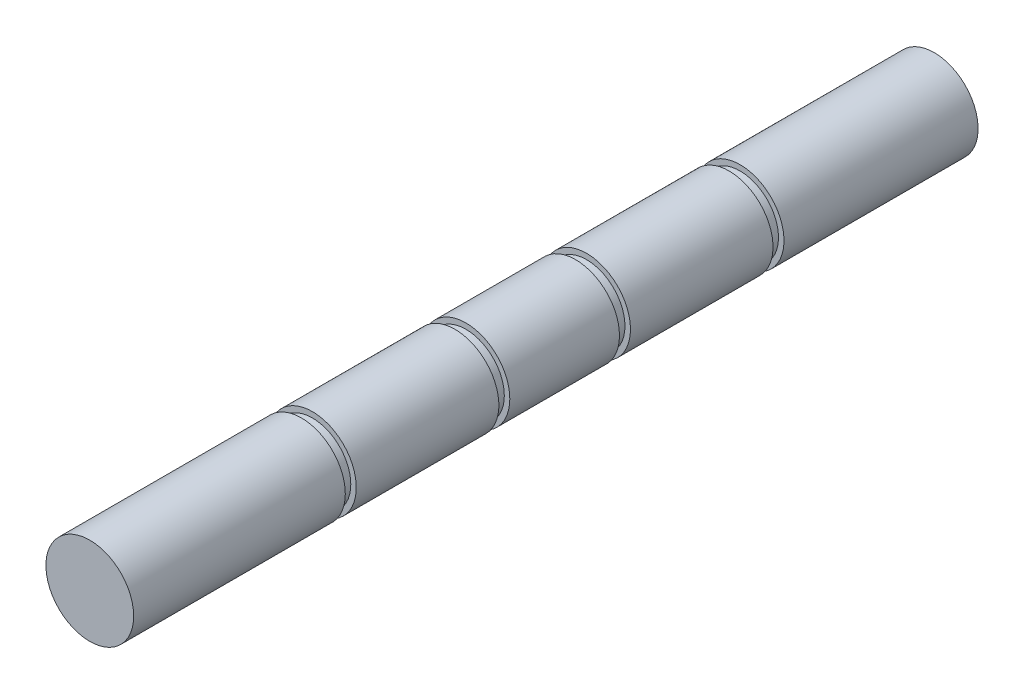
ISO-10303-21;
HEADER;
FILE_DESCRIPTION(('STEP AP214'),'2;1');
FILE_NAME('part.step','',(''),(''),'','','');
FILE_SCHEMA(('AUTOMOTIVE_DESIGN { 1 0 10303 214 1 1 1 1 }'));
ENDSEC;
DATA;
#1=APPLICATION_CONTEXT('core data for automotive mechanical design processes');
#2=APPLICATION_PROTOCOL_DEFINITION('international standard','automotive_design',2000,#1);
#3=PRODUCT_CONTEXT('',#1,'mechanical');
#4=PRODUCT('Part','Part','',(#3));
#5=PRODUCT_RELATED_PRODUCT_CATEGORY('part','',(#4));
#6=PRODUCT_DEFINITION_FORMATION('','',#4);
#7=PRODUCT_DEFINITION_CONTEXT('part definition',#1,'design');
#8=PRODUCT_DEFINITION('design','',#6,#7);
#9=PRODUCT_DEFINITION_SHAPE('','',#8);
#10=(LENGTH_UNIT() NAMED_UNIT(*) SI_UNIT(.MILLI.,.METRE.));
#11=(NAMED_UNIT(*) PLANE_ANGLE_UNIT() SI_UNIT($,.RADIAN.));
#12=(NAMED_UNIT(*) SI_UNIT($,.STERADIAN.) SOLID_ANGLE_UNIT());
#13=UNCERTAINTY_MEASURE_WITH_UNIT(LENGTH_MEASURE(1.E-05),#10,'distance_accuracy_value','');
#14=(GEOMETRIC_REPRESENTATION_CONTEXT(3) GLOBAL_UNCERTAINTY_ASSIGNED_CONTEXT((#13)) GLOBAL_UNIT_ASSIGNED_CONTEXT((#10,
#11,#12)) REPRESENTATION_CONTEXT('',''));
#15=CARTESIAN_POINT('',(0.,0.,0.));
#16=DIRECTION('',(0.,0.,1.));
#17=DIRECTION('',(1.,0.,0.));
#18=AXIS2_PLACEMENT_3D('',#15,#16,#17);
#19=CARTESIAN_POINT('',(0.,0.,77.));
#20=DIRECTION('',(0.,0.,-1.));
#21=DIRECTION('',(-1.,0.,0.));
#22=AXIS2_PLACEMENT_3D('',#19,#20,#21);
#23=CYLINDRICAL_SURFACE('',#22,3.5);
#24=CARTESIAN_POINT('',(0.,0.,56.7));
#25=DIRECTION('',(0.,0.,1.));
#26=DIRECTION('',(1.,0.,0.));
#27=AXIS2_PLACEMENT_3D('',#24,#25,#26);
#28=CIRCLE('',#27,3.5);
#29=CARTESIAN_POINT('',(3.5,0.,56.7));
#30=VERTEX_POINT('',#29);
#31=EDGE_CURVE('E49',#30,#30,#28,.T.);
#32=ORIENTED_EDGE('',*,*,#31,.T.);
#33=EDGE_LOOP('',(#32));
#34=FACE_BOUND('',#33,.T.);
#35=CARTESIAN_POINT('',(0.,0.,57.7));
#36=DIRECTION('',(0.,0.,1.));
#37=DIRECTION('',(1.,0.,0.));
#38=AXIS2_PLACEMENT_3D('',#35,#36,#37);
#39=CIRCLE('',#38,3.5);
#40=CARTESIAN_POINT('',(3.5,0.,57.7));
#41=VERTEX_POINT('',#40);
#42=EDGE_CURVE('E10',#41,#41,#39,.T.);
#43=ORIENTED_EDGE('',*,*,#42,.F.);
#44=EDGE_LOOP('',(#43));
#45=FACE_BOUND('',#44,.T.);
#46=ADVANCED_FACE('F30',(#34,#45),#23,.T.);
#47=CARTESIAN_POINT('',(0.,0.,42.7));
#48=DIRECTION('',(0.,0.,1.));
#49=DIRECTION('',(1.,0.,0.));
#50=AXIS2_PLACEMENT_3D('',#47,#48,#49);
#51=CIRCLE('',#50,3.5);
#52=CARTESIAN_POINT('',(3.5,0.,42.7));
#53=VERTEX_POINT('',#52);
#54=EDGE_CURVE('E48',#53,#53,#51,.T.);
#55=ORIENTED_EDGE('',*,*,#54,.T.);
#56=EDGE_LOOP('',(#55));
#57=FACE_BOUND('',#56,.T.);
#58=CARTESIAN_POINT('',(0.,0.,43.7));
#59=DIRECTION('',(0.,0.,1.));
#60=DIRECTION('',(1.,0.,0.));
#61=AXIS2_PLACEMENT_3D('',#58,#59,#60);
#62=CIRCLE('',#61,3.5);
#63=CARTESIAN_POINT('',(3.5,0.,43.7));
#64=VERTEX_POINT('',#63);
#65=EDGE_CURVE('E36',#64,#64,#62,.T.);
#66=ORIENTED_EDGE('',*,*,#65,.F.);
#67=EDGE_LOOP('',(#66));
#68=FACE_BOUND('',#67,.T.);
#69=ADVANCED_FACE('F117',(#57,#68),#23,.T.);
#70=CARTESIAN_POINT('',(0.,0.,31.7));
#71=DIRECTION('',(0.,0.,1.));
#72=DIRECTION('',(1.,0.,0.));
#73=AXIS2_PLACEMENT_3D('',#70,#71,#72);
#74=CIRCLE('',#73,3.5);
#75=CARTESIAN_POINT('',(3.5,0.,31.7));
#76=VERTEX_POINT('',#75);
#77=EDGE_CURVE('E75',#76,#76,#74,.T.);
#78=ORIENTED_EDGE('',*,*,#77,.T.);
#79=EDGE_LOOP('',(#78));
#80=FACE_BOUND('',#79,.T.);
#81=CARTESIAN_POINT('',(0.,0.,32.7));
#82=DIRECTION('',(0.,0.,1.));
#83=DIRECTION('',(1.,0.,0.));
#84=AXIS2_PLACEMENT_3D('',#81,#82,#83);
#85=CIRCLE('',#84,3.5);
#86=CARTESIAN_POINT('',(3.5,0.,32.7));
#87=VERTEX_POINT('',#86);
#88=EDGE_CURVE('E40',#87,#87,#85,.T.);
#89=ORIENTED_EDGE('',*,*,#88,.F.);
#90=EDGE_LOOP('',(#89));
#91=FACE_BOUND('',#90,.T.);
#92=ADVANCED_FACE('F93',(#80,#91),#23,.T.);
#93=CARTESIAN_POINT('',(0.,0.,17.7));
#94=DIRECTION('',(0.,0.,-1.));
#95=DIRECTION('',(-1.,0.,0.));
#96=AXIS2_PLACEMENT_3D('',#93,#94,#95);
#97=CIRCLE('',#96,3.5);
#98=CARTESIAN_POINT('',(-3.5,0.,17.7));
#99=VERTEX_POINT('',#98);
#100=EDGE_CURVE('E82',#99,#99,#97,.T.);
#101=ORIENTED_EDGE('',*,*,#100,.F.);
#102=EDGE_LOOP('',(#101));
#103=FACE_BOUND('',#102,.T.);
#104=CARTESIAN_POINT('',(0.,0.,18.7));
#105=DIRECTION('',(0.,0.,1.));
#106=DIRECTION('',(1.,0.,0.));
#107=AXIS2_PLACEMENT_3D('',#104,#105,#106);
#108=CIRCLE('',#107,3.5);
#109=CARTESIAN_POINT('',(3.5,0.,18.7));
#110=VERTEX_POINT('',#109);
#111=EDGE_CURVE('E45',#110,#110,#108,.T.);
#112=ORIENTED_EDGE('',*,*,#111,.F.);
#113=EDGE_LOOP('',(#112));
#114=FACE_BOUND('',#113,.T.);
#115=ADVANCED_FACE('F118',(#103,#114),#23,.T.);
#116=CARTESIAN_POINT('',(0.,0.,17.7));
#117=DIRECTION('',(0.,0.,-1.));
#118=DIRECTION('',(-1.,0.,0.));
#119=AXIS2_PLACEMENT_3D('',#116,#117,#118);
#120=CYLINDRICAL_SURFACE('',#119,4.);
#121=CARTESIAN_POINT('',(0.,0.,17.7));
#122=DIRECTION('',(0.,0.,-1.));
#123=DIRECTION('',(-1.,0.,0.));
#124=AXIS2_PLACEMENT_3D('',#121,#122,#123);
#125=CIRCLE('',#124,4.);
#126=CARTESIAN_POINT('',(-4.,0.,17.7));
#127=VERTEX_POINT('',#126);
#128=EDGE_CURVE('E79',#127,#127,#125,.T.);
#129=ORIENTED_EDGE('',*,*,#128,.T.);
#130=EDGE_LOOP('',(#129));
#131=FACE_BOUND('',#130,.T.);
#132=CARTESIAN_POINT('',(0.,0.,0.));
#133=DIRECTION('',(0.,0.,-1.));
#134=DIRECTION('',(-1.,0.,0.));
#135=AXIS2_PLACEMENT_3D('',#132,#133,#134);
#136=CIRCLE('',#135,4.);
#137=CARTESIAN_POINT('',(-4.,0.,0.));
#138=VERTEX_POINT('',#137);
#139=EDGE_CURVE('E83',#138,#138,#136,.T.);
#140=ORIENTED_EDGE('',*,*,#139,.F.);
#141=EDGE_LOOP('',(#140));
#142=FACE_BOUND('',#141,.T.);
#143=ADVANCED_FACE('F125',(#131,#142),#120,.T.);
#144=CARTESIAN_POINT('',(0.,0.,17.7));
#145=DIRECTION('',(0.,0.,-1.));
#146=DIRECTION('',(-1.,0.,0.));
#147=AXIS2_PLACEMENT_3D('',#144,#145,#146);
#148=PLANE('',#147);
#149=ORIENTED_EDGE('',*,*,#100,.T.);
#150=EDGE_LOOP('',(#149));
#151=FACE_BOUND('',#150,.T.);
#152=ORIENTED_EDGE('',*,*,#128,.F.);
#153=EDGE_LOOP('',(#152));
#154=FACE_BOUND('',#153,.T.);
#155=ADVANCED_FACE('F131',(#151,#154),#148,.F.);
#156=CARTESIAN_POINT('',(0.,0.,0.));
#157=DIRECTION('',(0.,0.,1.));
#158=DIRECTION('',(1.,0.,0.));
#159=AXIS2_PLACEMENT_3D('',#156,#157,#158);
#160=PLANE('',#159);
#161=ORIENTED_EDGE('',*,*,#139,.T.);
#162=EDGE_LOOP('',(#161));
#163=FACE_BOUND('',#162,.T.);
#164=ADVANCED_FACE('F100',(#163),#160,.F.);
#165=CARTESIAN_POINT('',(0.,0.,31.7));
#166=DIRECTION('',(0.,0.,1.));
#167=DIRECTION('',(1.,0.,0.));
#168=AXIS2_PLACEMENT_3D('',#165,#166,#167);
#169=PLANE('',#168);
#170=ORIENTED_EDGE('',*,*,#77,.F.);
#171=EDGE_LOOP('',(#170));
#172=FACE_BOUND('',#171,.T.);
#173=CARTESIAN_POINT('',(0.,0.,31.7));
#174=DIRECTION('',(0.,0.,1.));
#175=DIRECTION('',(1.,0.,0.));
#176=AXIS2_PLACEMENT_3D('',#173,#174,#175);
#177=CIRCLE('',#176,4.);
#178=CARTESIAN_POINT('',(-4.,0.,31.7));
#179=VERTEX_POINT('',#178);
#180=EDGE_CURVE('E72',#179,#179,#177,.T.);
#181=ORIENTED_EDGE('',*,*,#180,.T.);
#182=EDGE_LOOP('',(#181));
#183=FACE_BOUND('',#182,.T.);
#184=ADVANCED_FACE('F96',(#172,#183),#169,.T.);
#185=CARTESIAN_POINT('',(0.,0.,18.7));
#186=DIRECTION('',(0.,0.,1.));
#187=DIRECTION('',(1.,0.,0.));
#188=AXIS2_PLACEMENT_3D('',#185,#186,#187);
#189=PLANE('',#188);
#190=ORIENTED_EDGE('',*,*,#111,.T.);
#191=EDGE_LOOP('',(#190));
#192=FACE_BOUND('',#191,.T.);
#193=CARTESIAN_POINT('',(0.,0.,18.7));
#194=DIRECTION('',(0.,0.,1.));
#195=DIRECTION('',(1.,0.,0.));
#196=AXIS2_PLACEMENT_3D('',#193,#194,#195);
#197=CIRCLE('',#196,4.);
#198=CARTESIAN_POINT('',(-4.,0.,18.7));
#199=VERTEX_POINT('',#198);
#200=EDGE_CURVE('E76',#199,#199,#197,.T.);
#201=ORIENTED_EDGE('',*,*,#200,.F.);
#202=EDGE_LOOP('',(#201));
#203=FACE_BOUND('',#202,.T.);
#204=ADVANCED_FACE('F99',(#192,#203),#189,.F.);
#205=CARTESIAN_POINT('',(0.,0.,31.7));
#206=DIRECTION('',(0.,0.,-1.));
#207=DIRECTION('',(-1.,0.,0.));
#208=AXIS2_PLACEMENT_3D('',#205,#206,#207);
#209=CYLINDRICAL_SURFACE('',#208,4.);
#210=CARTESIAN_POINT('',(-4.,0.,31.7));
#211=CARTESIAN_POINT('',(-4.,0.,31.5645833333333));
#212=CARTESIAN_POINT('',(-4.,0.,31.4291666666667));
#213=CARTESIAN_POINT('',(-4.,0.,31.1583333333333));
#214=CARTESIAN_POINT('',(-4.,0.,31.0229166666667));
#215=CARTESIAN_POINT('',(-4.,0.,30.7520833333333));
#216=CARTESIAN_POINT('',(-4.,0.,30.6166666666667));
#217=CARTESIAN_POINT('',(-4.,0.,30.3458333333333));
#218=CARTESIAN_POINT('',(-4.,0.,30.2104166666667));
#219=CARTESIAN_POINT('',(-4.,0.,29.9395833333333));
#220=CARTESIAN_POINT('',(-4.,0.,29.8041666666667));
#221=CARTESIAN_POINT('',(-4.,0.,29.5333333333333));
#222=CARTESIAN_POINT('',(-4.,0.,29.3979166666667));
#223=CARTESIAN_POINT('',(-4.,0.,29.1270833333333));
#224=CARTESIAN_POINT('',(-4.,0.,28.9916666666667));
#225=CARTESIAN_POINT('',(-4.,0.,28.7208333333333));
#226=CARTESIAN_POINT('',(-4.,0.,28.5854166666667));
#227=CARTESIAN_POINT('',(-4.,0.,28.3145833333333));
#228=CARTESIAN_POINT('',(-4.,0.,28.1791666666667));
#229=CARTESIAN_POINT('',(-4.,0.,27.9083333333333));
#230=CARTESIAN_POINT('',(-4.,0.,27.7729166666667));
#231=CARTESIAN_POINT('',(-4.,0.,27.5020833333333));
#232=CARTESIAN_POINT('',(-4.,0.,27.3666666666667));
#233=CARTESIAN_POINT('',(-4.,0.,27.0958333333333));
#234=CARTESIAN_POINT('',(-4.,0.,26.9604166666667));
#235=CARTESIAN_POINT('',(-4.,0.,26.6895833333333));
#236=CARTESIAN_POINT('',(-4.,0.,26.5541666666667));
#237=CARTESIAN_POINT('',(-4.,0.,26.2833333333333));
#238=CARTESIAN_POINT('',(-4.,0.,26.1479166666667));
#239=CARTESIAN_POINT('',(-4.,0.,25.8770833333333));
#240=CARTESIAN_POINT('',(-4.,0.,25.7416666666667));
#241=CARTESIAN_POINT('',(-4.,0.,25.4708333333333));
#242=CARTESIAN_POINT('',(-4.,0.,25.3354166666667));
#243=CARTESIAN_POINT('',(-4.,0.,25.0645833333333));
#244=CARTESIAN_POINT('',(-4.,0.,24.9291666666667));
#245=CARTESIAN_POINT('',(-4.,0.,24.6583333333333));
#246=CARTESIAN_POINT('',(-4.,0.,24.5229166666667));
#247=CARTESIAN_POINT('',(-4.,0.,24.2520833333333));
#248=CARTESIAN_POINT('',(-4.,0.,24.1166666666667));
#249=CARTESIAN_POINT('',(-4.,0.,23.8458333333333));
#250=CARTESIAN_POINT('',(-4.,0.,23.7104166666667));
#251=CARTESIAN_POINT('',(-4.,0.,23.4395833333333));
#252=CARTESIAN_POINT('',(-4.,0.,23.3041666666667));
#253=CARTESIAN_POINT('',(-4.,0.,23.0333333333333));
#254=CARTESIAN_POINT('',(-4.,0.,22.8979166666667));
#255=CARTESIAN_POINT('',(-4.,0.,22.6270833333333));
#256=CARTESIAN_POINT('',(-4.,0.,22.4916666666667));
#257=CARTESIAN_POINT('',(-4.,0.,22.2208333333333));
#258=CARTESIAN_POINT('',(-4.,0.,22.0854166666667));
#259=CARTESIAN_POINT('',(-4.,0.,21.8145833333333));
#260=CARTESIAN_POINT('',(-4.,0.,21.6791666666667));
#261=CARTESIAN_POINT('',(-4.,0.,21.4083333333333));
#262=CARTESIAN_POINT('',(-4.,0.,21.2729166666667));
#263=CARTESIAN_POINT('',(-4.,0.,21.0020833333333));
#264=CARTESIAN_POINT('',(-4.,0.,20.8666666666667));
#265=CARTESIAN_POINT('',(-4.,0.,20.5958333333333));
#266=CARTESIAN_POINT('',(-4.,0.,20.4604166666667));
#267=CARTESIAN_POINT('',(-4.,0.,20.1895833333333));
#268=CARTESIAN_POINT('',(-4.,0.,20.0541666666667));
#269=CARTESIAN_POINT('',(-4.,0.,19.7833333333333));
#270=CARTESIAN_POINT('',(-4.,0.,19.6479166666667));
#271=CARTESIAN_POINT('',(-4.,0.,19.3770833333333));
#272=CARTESIAN_POINT('',(-4.,0.,19.2416666666667));
#273=CARTESIAN_POINT('',(-4.,0.,18.9708333333333));
#274=CARTESIAN_POINT('',(-4.,0.,18.8354166666667));
#275=CARTESIAN_POINT('',(-4.,0.,18.7));
#276=B_SPLINE_CURVE_WITH_KNOTS('',3,(#210,#211,#212,#213,#214,#215,#216,#217,#218,#219,#220,
#221,#222,#223,#224,#225,#226,#227,#228,#229,#230,#231,#232,#233,#234,#235,#236,#237,#238,#239,
#240,#241,#242,#243,#244,#245,#246,#247,#248,#249,#250,#251,#252,#253,#254,#255,#256,#257,#258,
#259,#260,#261,#262,#263,#264,#265,#266,#267,#268,#269,#270,#271,#272,#273,#274,#275),
.UNSPECIFIED.,.F.,.F.,(4,2,2,2,2,2,2,2,2,2,2,2,2,2,2,2,2,2,2,2,2,2,2,2,2,2,2,2,2,2,2,2,4),(0.,
0.406250000000004,0.812500000000004,1.21875,1.625,2.03125,2.4375,2.84375,3.25,3.65625,4.0625,
4.46875,4.875,5.28125,5.6875,6.09375,6.5,6.90625,7.3125,7.71875,8.125,8.53125,8.9375,9.34375,
9.75,10.15625,10.5625,10.96875,11.375,11.78125,12.1875,12.59375,13.),.UNSPECIFIED.);
#277=EDGE_CURVE('BSEAM104',#179,#199,#276,.T.);
#278=ORIENTED_EDGE('',*,*,#180,.F.);
#279=ORIENTED_EDGE('',*,*,#200,.T.);
#280=ORIENTED_EDGE('',*,*,#277,.T.);
#281=ORIENTED_EDGE('',*,*,#277,.F.);
#282=EDGE_LOOP('',(#278,#280,#279,#281));
#283=FACE_BOUND('',#282,.T.);
#284=ADVANCED_FACE('F104',(#283),#209,.T.);
#285=CARTESIAN_POINT('',(0.,0.,42.7));
#286=DIRECTION('',(0.,0.,1.));
#287=DIRECTION('',(1.,0.,0.));
#288=AXIS2_PLACEMENT_3D('',#285,#286,#287);
#289=PLANE('',#288);
#290=ORIENTED_EDGE('',*,*,#54,.F.);
#291=EDGE_LOOP('',(#290));
#292=FACE_BOUND('',#291,.T.);
#293=CARTESIAN_POINT('',(0.,0.,42.7));
#294=DIRECTION('',(0.,0.,1.));
#295=DIRECTION('',(1.,0.,0.));
#296=AXIS2_PLACEMENT_3D('',#293,#294,#295);
#297=CIRCLE('',#296,4.);
#298=CARTESIAN_POINT('',(4.,0.,42.7));
#299=VERTEX_POINT('',#298);
#300=EDGE_CURVE('E56',#299,#299,#297,.T.);
#301=ORIENTED_EDGE('',*,*,#300,.T.);
#302=EDGE_LOOP('',(#301));
#303=FACE_BOUND('',#302,.T.);
#304=ADVANCED_FACE('F107',(#292,#303),#289,.T.);
#305=CARTESIAN_POINT('',(0.,0.,32.7));
#306=DIRECTION('',(0.,0.,1.));
#307=DIRECTION('',(1.,0.,0.));
#308=AXIS2_PLACEMENT_3D('',#305,#306,#307);
#309=PLANE('',#308);
#310=ORIENTED_EDGE('',*,*,#88,.T.);
#311=EDGE_LOOP('',(#310));
#312=FACE_BOUND('',#311,.T.);
#313=CARTESIAN_POINT('',(0.,0.,32.7));
#314=DIRECTION('',(0.,0.,1.));
#315=DIRECTION('',(1.,0.,0.));
#316=AXIS2_PLACEMENT_3D('',#313,#314,#315);
#317=CIRCLE('',#316,4.);
#318=CARTESIAN_POINT('',(4.,0.,32.7));
#319=VERTEX_POINT('',#318);
#320=EDGE_CURVE('E51',#319,#319,#317,.T.);
#321=ORIENTED_EDGE('',*,*,#320,.F.);
#322=EDGE_LOOP('',(#321));
#323=FACE_BOUND('',#322,.T.);
#324=ADVANCED_FACE('F184',(#312,#323),#309,.F.);
#325=CARTESIAN_POINT('',(0.,0.,42.7));
#326=DIRECTION('',(0.,0.,-1.));
#327=DIRECTION('',(-1.,0.,0.));
#328=AXIS2_PLACEMENT_3D('',#325,#326,#327);
#329=CYLINDRICAL_SURFACE('',#328,4.);
#330=ORIENTED_EDGE('',*,*,#300,.F.);
#331=EDGE_LOOP('',(#330));
#332=FACE_BOUND('',#331,.T.);
#333=ORIENTED_EDGE('',*,*,#320,.T.);
#334=EDGE_LOOP('',(#333));
#335=FACE_BOUND('',#334,.T.);
#336=ADVANCED_FACE('F178',(#332,#335),#329,.T.);
#337=CARTESIAN_POINT('',(0.,0.,56.7));
#338=DIRECTION('',(0.,0.,1.));
#339=DIRECTION('',(1.,0.,0.));
#340=AXIS2_PLACEMENT_3D('',#337,#338,#339);
#341=PLANE('',#340);
#342=ORIENTED_EDGE('',*,*,#31,.F.);
#343=EDGE_LOOP('',(#342));
#344=FACE_BOUND('',#343,.T.);
#345=CARTESIAN_POINT('',(0.,0.,56.7));
#346=DIRECTION('',(0.,0.,1.));
#347=DIRECTION('',(1.,0.,0.));
#348=AXIS2_PLACEMENT_3D('',#345,#346,#347);
#349=CIRCLE('',#348,4.);
#350=CARTESIAN_POINT('',(-4.,0.,56.7));
#351=VERTEX_POINT('',#350);
#352=EDGE_CURVE('E52',#351,#351,#349,.T.);
#353=ORIENTED_EDGE('',*,*,#352,.T.);
#354=EDGE_LOOP('',(#353));
#355=FACE_BOUND('',#354,.T.);
#356=ADVANCED_FACE('F175',(#344,#355),#341,.T.);
#357=CARTESIAN_POINT('',(0.,0.,43.7));
#358=DIRECTION('',(0.,0.,1.));
#359=DIRECTION('',(1.,0.,0.));
#360=AXIS2_PLACEMENT_3D('',#357,#358,#359);
#361=PLANE('',#360);
#362=ORIENTED_EDGE('',*,*,#65,.T.);
#363=EDGE_LOOP('',(#362));
#364=FACE_BOUND('',#363,.T.);
#365=CARTESIAN_POINT('',(0.,0.,43.7));
#366=DIRECTION('',(0.,0.,1.));
#367=DIRECTION('',(1.,0.,0.));
#368=AXIS2_PLACEMENT_3D('',#365,#366,#367);
#369=CIRCLE('',#368,4.);
#370=CARTESIAN_POINT('',(-4.,0.,43.7));
#371=VERTEX_POINT('',#370);
#372=EDGE_CURVE('E59',#371,#371,#369,.T.);
#373=ORIENTED_EDGE('',*,*,#372,.F.);
#374=EDGE_LOOP('',(#373));
#375=FACE_BOUND('',#374,.T.);
#376=ADVANCED_FACE('F171',(#364,#375),#361,.F.);
#377=CARTESIAN_POINT('',(0.,0.,56.7));
#378=DIRECTION('',(0.,0.,-1.));
#379=DIRECTION('',(-1.,0.,0.));
#380=AXIS2_PLACEMENT_3D('',#377,#378,#379);
#381=CYLINDRICAL_SURFACE('',#380,4.);
#382=CARTESIAN_POINT('',(-4.,0.,56.7));
#383=CARTESIAN_POINT('',(-4.,0.,56.5645833333333));
#384=CARTESIAN_POINT('',(-4.,0.,56.4291666666667));
#385=CARTESIAN_POINT('',(-4.,0.,56.1583333333333));
#386=CARTESIAN_POINT('',(-4.,0.,56.0229166666667));
#387=CARTESIAN_POINT('',(-4.,0.,55.7520833333333));
#388=CARTESIAN_POINT('',(-4.,0.,55.6166666666667));
#389=CARTESIAN_POINT('',(-4.,0.,55.3458333333333));
#390=CARTESIAN_POINT('',(-4.,0.,55.2104166666667));
#391=CARTESIAN_POINT('',(-4.,0.,54.9395833333333));
#392=CARTESIAN_POINT('',(-4.,0.,54.8041666666667));
#393=CARTESIAN_POINT('',(-4.,0.,54.5333333333333));
#394=CARTESIAN_POINT('',(-4.,0.,54.3979166666667));
#395=CARTESIAN_POINT('',(-4.,0.,54.1270833333333));
#396=CARTESIAN_POINT('',(-4.,0.,53.9916666666667));
#397=CARTESIAN_POINT('',(-4.,0.,53.7208333333333));
#398=CARTESIAN_POINT('',(-4.,0.,53.5854166666667));
#399=CARTESIAN_POINT('',(-4.,0.,53.3145833333333));
#400=CARTESIAN_POINT('',(-4.,0.,53.1791666666667));
#401=CARTESIAN_POINT('',(-4.,0.,52.9083333333333));
#402=CARTESIAN_POINT('',(-4.,0.,52.7729166666667));
#403=CARTESIAN_POINT('',(-4.,0.,52.5020833333333));
#404=CARTESIAN_POINT('',(-4.,0.,52.3666666666667));
#405=CARTESIAN_POINT('',(-4.,0.,52.0958333333333));
#406=CARTESIAN_POINT('',(-4.,0.,51.9604166666667));
#407=CARTESIAN_POINT('',(-4.,0.,51.6895833333333));
#408=CARTESIAN_POINT('',(-4.,0.,51.5541666666667));
#409=CARTESIAN_POINT('',(-4.,0.,51.2833333333333));
#410=CARTESIAN_POINT('',(-4.,0.,51.1479166666667));
#411=CARTESIAN_POINT('',(-4.,0.,50.8770833333333));
#412=CARTESIAN_POINT('',(-4.,0.,50.7416666666667));
#413=CARTESIAN_POINT('',(-4.,0.,50.4708333333333));
#414=CARTESIAN_POINT('',(-4.,0.,50.3354166666667));
#415=CARTESIAN_POINT('',(-4.,0.,50.0645833333333));
#416=CARTESIAN_POINT('',(-4.,0.,49.9291666666667));
#417=CARTESIAN_POINT('',(-4.,0.,49.6583333333333));
#418=CARTESIAN_POINT('',(-4.,0.,49.5229166666667));
#419=CARTESIAN_POINT('',(-4.,0.,49.2520833333333));
#420=CARTESIAN_POINT('',(-4.,0.,49.1166666666667));
#421=CARTESIAN_POINT('',(-4.,0.,48.8458333333333));
#422=CARTESIAN_POINT('',(-4.,0.,48.7104166666667));
#423=CARTESIAN_POINT('',(-4.,0.,48.4395833333333));
#424=CARTESIAN_POINT('',(-4.,0.,48.3041666666667));
#425=CARTESIAN_POINT('',(-4.,0.,48.0333333333333));
#426=CARTESIAN_POINT('',(-4.,0.,47.8979166666667));
#427=CARTESIAN_POINT('',(-4.,0.,47.6270833333333));
#428=CARTESIAN_POINT('',(-4.,0.,47.4916666666667));
#429=CARTESIAN_POINT('',(-4.,0.,47.2208333333333));
#430=CARTESIAN_POINT('',(-4.,0.,47.0854166666667));
#431=CARTESIAN_POINT('',(-4.,0.,46.8145833333333));
#432=CARTESIAN_POINT('',(-4.,0.,46.6791666666667));
#433=CARTESIAN_POINT('',(-4.,0.,46.4083333333333));
#434=CARTESIAN_POINT('',(-4.,0.,46.2729166666667));
#435=CARTESIAN_POINT('',(-4.,0.,46.0020833333333));
#436=CARTESIAN_POINT('',(-4.,0.,45.8666666666667));
#437=CARTESIAN_POINT('',(-4.,0.,45.5958333333333));
#438=CARTESIAN_POINT('',(-4.,0.,45.4604166666667));
#439=CARTESIAN_POINT('',(-4.,0.,45.1895833333333));
#440=CARTESIAN_POINT('',(-4.,0.,45.0541666666667));
#441=CARTESIAN_POINT('',(-4.,0.,44.7833333333333));
#442=CARTESIAN_POINT('',(-4.,0.,44.6479166666667));
#443=CARTESIAN_POINT('',(-4.,0.,44.3770833333333));
#444=CARTESIAN_POINT('',(-4.,0.,44.2416666666667));
#445=CARTESIAN_POINT('',(-4.,0.,43.9708333333333));
#446=CARTESIAN_POINT('',(-4.,0.,43.8354166666667));
#447=CARTESIAN_POINT('',(-4.,0.,43.7));
#448=B_SPLINE_CURVE_WITH_KNOTS('',3,(#382,#383,#384,#385,#386,#387,#388,#389,#390,#391,#392,
#393,#394,#395,#396,#397,#398,#399,#400,#401,#402,#403,#404,#405,#406,#407,#408,#409,#410,#411,
#412,#413,#414,#415,#416,#417,#418,#419,#420,#421,#422,#423,#424,#425,#426,#427,#428,#429,#430,
#431,#432,#433,#434,#435,#436,#437,#438,#439,#440,#441,#442,#443,#444,#445,#446,#447),
.UNSPECIFIED.,.F.,.F.,(4,2,2,2,2,2,2,2,2,2,2,2,2,2,2,2,2,2,2,2,2,2,2,2,2,2,2,2,2,2,2,2,4),(0.,
0.406250000000004,0.812500000000001,1.21875,1.625,2.03125000000001,2.4375,2.84375000000001,3.25,
3.65625,4.0625,4.46875,4.875,5.28125,5.68750000000001,6.09375,6.50000000000001,6.90625,7.3125,
7.71875,8.125,8.53125,8.9375,9.34375000000001,9.75,10.15625,10.5625,10.96875,11.375,11.78125,
12.1875,12.59375,13.),.UNSPECIFIED.);
#449=EDGE_CURVE('BSEAM166',#351,#371,#448,.T.);
#450=ORIENTED_EDGE('',*,*,#352,.F.);
#451=ORIENTED_EDGE('',*,*,#372,.T.);
#452=ORIENTED_EDGE('',*,*,#449,.T.);
#453=ORIENTED_EDGE('',*,*,#449,.F.);
#454=EDGE_LOOP('',(#450,#452,#451,#453));
#455=FACE_BOUND('',#454,.T.);
#456=ADVANCED_FACE('F166',(#455),#381,.T.);
#457=CARTESIAN_POINT('',(0.,0.,88.3137084989848));
#458=DIRECTION('',(0.,0.,-1.));
#459=DIRECTION('',(-1.,0.,0.));
#460=AXIS2_PLACEMENT_3D('',#457,#458,#459);
#461=CYLINDRICAL_SURFACE('',#460,4.);
#462=CARTESIAN_POINT('',(0.,0.,57.7));
#463=DIRECTION('',(0.,0.,1.));
#464=DIRECTION('',(1.,0.,0.));
#465=AXIS2_PLACEMENT_3D('',#462,#463,#464);
#466=CIRCLE('',#465,4.);
#467=CARTESIAN_POINT('',(4.,0.,57.7));
#468=VERTEX_POINT('',#467);
#469=EDGE_CURVE('E67',#468,#468,#466,.T.);
#470=ORIENTED_EDGE('',*,*,#469,.T.);
#471=EDGE_LOOP('',(#470));
#472=FACE_BOUND('',#471,.T.);
#473=CARTESIAN_POINT('',(0.,0.,77.));
#474=DIRECTION('',(0.,0.,1.));
#475=DIRECTION('',(1.,0.,0.));
#476=AXIS2_PLACEMENT_3D('',#473,#474,#475);
#477=CIRCLE('',#476,4.);
#478=CARTESIAN_POINT('',(4.,0.,77.));
#479=VERTEX_POINT('',#478);
#480=EDGE_CURVE('E64',#479,#479,#477,.T.);
#481=ORIENTED_EDGE('',*,*,#480,.F.);
#482=EDGE_LOOP('',(#481));
#483=FACE_BOUND('',#482,.T.);
#484=ADVANCED_FACE('F156',(#472,#483),#461,.T.);
#485=CARTESIAN_POINT('',(0.,0.,57.7));
#486=DIRECTION('',(0.,0.,1.));
#487=DIRECTION('',(1.,0.,0.));
#488=AXIS2_PLACEMENT_3D('',#485,#486,#487);
#489=PLANE('',#488);
#490=ORIENTED_EDGE('',*,*,#42,.T.);
#491=EDGE_LOOP('',(#490));
#492=FACE_BOUND('',#491,.T.);
#493=ORIENTED_EDGE('',*,*,#469,.F.);
#494=EDGE_LOOP('',(#493));
#495=FACE_BOUND('',#494,.T.);
#496=ADVANCED_FACE('F151',(#492,#495),#489,.F.);
#497=CARTESIAN_POINT('',(0.,0.,77.));
#498=DIRECTION('',(0.,0.,1.));
#499=DIRECTION('',(1.,0.,0.));
#500=AXIS2_PLACEMENT_3D('',#497,#498,#499);
#501=PLANE('',#500);
#502=ORIENTED_EDGE('',*,*,#480,.T.);
#503=EDGE_LOOP('',(#502));
#504=FACE_BOUND('',#503,.T.);
#505=ADVANCED_FACE('F149',(#504),#501,.T.);
#506=CLOSED_SHELL('',(#46,#69,#92,#115,#143,#155,#164,#184,#204,#284,#304,#324,#336,#356,#376,
#456,#484,#496,#505));
#507=MANIFOLD_SOLID_BREP('B2',#506);
#508=ADVANCED_BREP_SHAPE_REPRESENTATION('',(#18,#507),#14);
#509=SHAPE_DEFINITION_REPRESENTATION(#9,#508);
ENDSEC;
END-ISO-10303-21;
